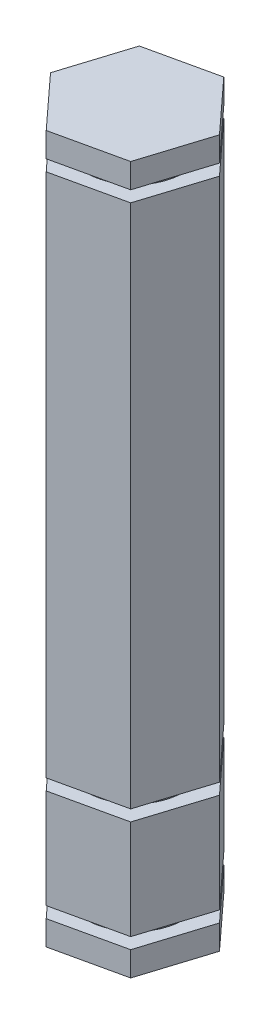
ISO-10303-21;
HEADER;
FILE_DESCRIPTION(('STEP AP214'),'2;1');
FILE_NAME('part.step','',(''),(''),'','','');
FILE_SCHEMA(('AUTOMOTIVE_DESIGN { 1 0 10303 214 1 1 1 1 }'));
ENDSEC;
DATA;
#1=APPLICATION_CONTEXT('core data for automotive mechanical design processes');
#2=APPLICATION_PROTOCOL_DEFINITION('international standard','automotive_design',2000,#1);
#3=PRODUCT_CONTEXT('',#1,'mechanical');
#4=PRODUCT('Part','Part','',(#3));
#5=PRODUCT_RELATED_PRODUCT_CATEGORY('part','',(#4));
#6=PRODUCT_DEFINITION_FORMATION('','',#4);
#7=PRODUCT_DEFINITION_CONTEXT('part definition',#1,'design');
#8=PRODUCT_DEFINITION('design','',#6,#7);
#9=PRODUCT_DEFINITION_SHAPE('','',#8);
#10=(LENGTH_UNIT() NAMED_UNIT(*) SI_UNIT(.MILLI.,.METRE.));
#11=(NAMED_UNIT(*) PLANE_ANGLE_UNIT() SI_UNIT($,.RADIAN.));
#12=(NAMED_UNIT(*) SI_UNIT($,.STERADIAN.) SOLID_ANGLE_UNIT());
#13=UNCERTAINTY_MEASURE_WITH_UNIT(LENGTH_MEASURE(1.E-05),#10,'distance_accuracy_value','');
#14=(GEOMETRIC_REPRESENTATION_CONTEXT(3) GLOBAL_UNCERTAINTY_ASSIGNED_CONTEXT((#13)) GLOBAL_UNIT_ASSIGNED_CONTEXT((#10,
#11,#12)) REPRESENTATION_CONTEXT('',''));
#15=CARTESIAN_POINT('',(0.,0.,0.));
#16=DIRECTION('',(0.,0.,1.));
#17=DIRECTION('',(1.,0.,0.));
#18=AXIS2_PLACEMENT_3D('',#15,#16,#17);
#19=CARTESIAN_POINT('',(0.,-11.4554,0.));
#20=DIRECTION('',(0.,-1.,0.));
#21=DIRECTION('',(0.,0.,-1.));
#22=AXIS2_PLACEMENT_3D('',#19,#20,#21);
#23=PLANE('',#22);
#24=DIRECTION('',(-0.30003437049555,0.,0.95392839171572));
#25=VECTOR('',#24,1.);
#26=CARTESIAN_POINT('',(7.1574235584254,-11.4554,-1.59204941463209));
#27=LINE('',#26,#25);
#28=CARTESIAN_POINT('',(7.1574235584254,-11.4554,-1.59204941463209));
#29=VERTEX_POINT('',#28);
#30=CARTESIAN_POINT('',(4.95746701636423,-11.4554,5.40248591992557));
#31=VERTEX_POINT('',#30);
#32=EDGE_CURVE('E240',#29,#31,#27,.T.);
#33=ORIENTED_EDGE('',*,*,#32,.T.);
#34=DIRECTION('',(-0.976143405864821,0.,0.217126809000241));
#35=VECTOR('',#34,1.);
#36=CARTESIAN_POINT('',(4.95746701636423,-11.4554,5.40248591992557));
#37=LINE('',#36,#35);
#38=CARTESIAN_POINT('',(-2.19995654206117,-11.4554,6.99453533455765));
#39=VERTEX_POINT('',#38);
#40=EDGE_CURVE('E268',#31,#39,#37,.T.);
#41=ORIENTED_EDGE('',*,*,#40,.T.);
#42=DIRECTION('',(-0.676109035369271,0.,-0.736801582715478));
#43=VECTOR('',#42,1.);
#44=CARTESIAN_POINT('',(-2.19995654206117,-11.4554,6.99453533455765));
#45=LINE('',#44,#43);
#46=CARTESIAN_POINT('',(-7.1574235584254,-11.4554,1.59204941463208));
#47=VERTEX_POINT('',#46);
#48=EDGE_CURVE('E265',#39,#47,#45,.T.);
#49=ORIENTED_EDGE('',*,*,#48,.T.);
#50=DIRECTION('',(0.30003437049555,0.,-0.953928391715719));
#51=VECTOR('',#50,1.);
#52=CARTESIAN_POINT('',(-7.1574235584254,-11.4554,1.59204941463208));
#53=LINE('',#52,#51);
#54=CARTESIAN_POINT('',(-4.95746701636423,-11.4554,-5.40248591992557));
#55=VERTEX_POINT('',#54);
#56=EDGE_CURVE('E262',#47,#55,#53,.T.);
#57=ORIENTED_EDGE('',*,*,#56,.T.);
#58=DIRECTION('',(0.976143405864821,0.,-0.217126809000241));
#59=VECTOR('',#58,1.);
#60=CARTESIAN_POINT('',(-4.95746701636423,-11.4554,-5.40248591992557));
#61=LINE('',#60,#59);
#62=CARTESIAN_POINT('',(2.19995654206117,-11.4554,-6.99453533455766));
#63=VERTEX_POINT('',#62);
#64=EDGE_CURVE('E259',#55,#63,#61,.T.);
#65=ORIENTED_EDGE('',*,*,#64,.T.);
#66=DIRECTION('',(0.676109035369271,0.,0.736801582715478));
#67=VECTOR('',#66,1.);
#68=CARTESIAN_POINT('',(2.19995654206117,-11.4554,-6.99453533455766));
#69=LINE('',#68,#67);
#70=EDGE_CURVE('E236',#63,#29,#69,.T.);
#71=ORIENTED_EDGE('',*,*,#70,.T.);
#72=EDGE_LOOP('',(#33,#41,#49,#57,#65,#71));
#73=FACE_BOUND('',#72,.T.);
#74=CARTESIAN_POINT('',(0.,-11.4554,0.));
#75=DIRECTION('',(0.,-1.,0.));
#76=DIRECTION('',(0.,0.,-1.));
#77=AXIS2_PLACEMENT_3D('',#74,#75,#76);
#78=CIRCLE('',#77,5.0292);
#79=CARTESIAN_POINT('',(0.,-11.4554,-5.0292));
#80=VERTEX_POINT('',#79);
#81=EDGE_CURVE('E273',#80,#80,#78,.T.);
#82=ORIENTED_EDGE('',*,*,#81,.F.);
#83=EDGE_LOOP('',(#82));
#84=FACE_BOUND('',#83,.T.);
#85=ADVANCED_FACE('F34',(#73,#84),#23,.T.);
#86=CARTESIAN_POINT('',(0.,0.,0.));
#87=DIRECTION('',(0.,1.,0.));
#88=DIRECTION('',(0.,0.,1.));
#89=AXIS2_PLACEMENT_3D('',#86,#87,#88);
#90=PLANE('',#89);
#91=DIRECTION('',(0.976143405864821,0.,-0.217126809000241));
#92=VECTOR('',#91,1.);
#93=CARTESIAN_POINT('',(-2.19995654206117,0.,6.99453533455765));
#94=LINE('',#93,#92);
#95=CARTESIAN_POINT('',(-2.19995654206117,0.,6.99453533455765));
#96=VERTEX_POINT('',#95);
#97=CARTESIAN_POINT('',(4.95746701636423,0.,5.40248591992557));
#98=VERTEX_POINT('',#97);
#99=EDGE_CURVE('E125',#96,#98,#94,.T.);
#100=ORIENTED_EDGE('',*,*,#99,.F.);
#101=DIRECTION('',(0.676109035369271,0.,0.736801582715478));
#102=VECTOR('',#101,1.);
#103=CARTESIAN_POINT('',(-7.1574235584254,0.,1.59204941463208));
#104=LINE('',#103,#102);
#105=CARTESIAN_POINT('',(-7.1574235584254,0.,1.59204941463208));
#106=VERTEX_POINT('',#105);
#107=EDGE_CURVE('E81',#106,#96,#104,.T.);
#108=ORIENTED_EDGE('',*,*,#107,.F.);
#109=DIRECTION('',(-0.30003437049555,0.,0.953928391715719));
#110=VECTOR('',#109,1.);
#111=CARTESIAN_POINT('',(-4.95746701636423,0.,-5.40248591992557));
#112=LINE('',#111,#110);
#113=CARTESIAN_POINT('',(-4.95746701636423,0.,-5.40248591992557));
#114=VERTEX_POINT('',#113);
#115=EDGE_CURVE('E75',#114,#106,#112,.T.);
#116=ORIENTED_EDGE('',*,*,#115,.F.);
#117=DIRECTION('',(-0.976143405864821,0.,0.217126809000241));
#118=VECTOR('',#117,1.);
#119=CARTESIAN_POINT('',(2.19995654206117,0.,-6.99453533455766));
#120=LINE('',#119,#118);
#121=CARTESIAN_POINT('',(2.19995654206117,0.,-6.99453533455766));
#122=VERTEX_POINT('',#121);
#123=EDGE_CURVE('E115',#122,#114,#120,.T.);
#124=ORIENTED_EDGE('',*,*,#123,.F.);
#125=DIRECTION('',(-0.676109035369271,0.,-0.736801582715478));
#126=VECTOR('',#125,1.);
#127=CARTESIAN_POINT('',(7.1574235584254,0.,-1.59204941463209));
#128=LINE('',#127,#126);
#129=CARTESIAN_POINT('',(7.1574235584254,0.,-1.59204941463209));
#130=VERTEX_POINT('',#129);
#131=EDGE_CURVE('E131',#130,#122,#128,.T.);
#132=ORIENTED_EDGE('',*,*,#131,.F.);
#133=DIRECTION('',(0.30003437049555,0.,-0.95392839171572));
#134=VECTOR('',#133,1.);
#135=CARTESIAN_POINT('',(4.95746701636423,0.,5.40248591992557));
#136=LINE('',#135,#134);
#137=EDGE_CURVE('E128',#98,#130,#136,.T.);
#138=ORIENTED_EDGE('',*,*,#137,.F.);
#139=EDGE_LOOP('',(#100,#108,#116,#124,#132,#138));
#140=FACE_BOUND('',#139,.T.);
#141=CARTESIAN_POINT('',(0.,0.,0.));
#142=DIRECTION('',(0.,1.,0.));
#143=DIRECTION('',(0.,0.,1.));
#144=AXIS2_PLACEMENT_3D('',#141,#142,#143);
#145=CIRCLE('',#144,5.0292);
#146=CARTESIAN_POINT('',(0.,0.,5.0292));
#147=VERTEX_POINT('',#146);
#148=EDGE_CURVE('E11',#147,#147,#145,.F.);
#149=ORIENTED_EDGE('',*,*,#148,.F.);
#150=EDGE_LOOP('',(#149));
#151=FACE_BOUND('',#150,.T.);
#152=ADVANCED_FACE('F148',(#140,#151),#90,.F.);
#153=CARTESIAN_POINT('',(0.,54.356,0.));
#154=DIRECTION('',(0.,1.,0.));
#155=DIRECTION('',(0.,0.,1.));
#156=AXIS2_PLACEMENT_3D('',#153,#154,#155);
#157=PLANE('',#156);
#158=DIRECTION('',(0.976143405864821,0.,-0.217126809000241));
#159=VECTOR('',#158,1.);
#160=CARTESIAN_POINT('',(-2.19995654206117,54.356,6.99453533455765));
#161=LINE('',#160,#159);
#162=CARTESIAN_POINT('',(-2.19995654206117,54.356,6.99453533455765));
#163=VERTEX_POINT('',#162);
#164=CARTESIAN_POINT('',(4.95746701636423,54.356,5.40248591992557));
#165=VERTEX_POINT('',#164);
#166=EDGE_CURVE('E136',#163,#165,#161,.T.);
#167=ORIENTED_EDGE('',*,*,#166,.T.);
#168=DIRECTION('',(0.30003437049555,0.,-0.95392839171572));
#169=VECTOR('',#168,1.);
#170=CARTESIAN_POINT('',(4.95746701636423,54.356,5.40248591992557));
#171=LINE('',#170,#169);
#172=CARTESIAN_POINT('',(7.1574235584254,54.356,-1.59204941463209));
#173=VERTEX_POINT('',#172);
#174=EDGE_CURVE('E90',#165,#173,#171,.T.);
#175=ORIENTED_EDGE('',*,*,#174,.T.);
#176=DIRECTION('',(-0.676109035369271,0.,-0.736801582715478));
#177=VECTOR('',#176,1.);
#178=CARTESIAN_POINT('',(7.1574235584254,54.356,-1.59204941463209));
#179=LINE('',#178,#177);
#180=CARTESIAN_POINT('',(2.19995654206117,54.356,-6.99453533455766));
#181=VERTEX_POINT('',#180);
#182=EDGE_CURVE('E107',#173,#181,#179,.T.);
#183=ORIENTED_EDGE('',*,*,#182,.T.);
#184=DIRECTION('',(-0.976143405864821,0.,0.217126809000241));
#185=VECTOR('',#184,1.);
#186=CARTESIAN_POINT('',(2.19995654206117,54.356,-6.99453533455766));
#187=LINE('',#186,#185);
#188=CARTESIAN_POINT('',(-4.95746701636423,54.356,-5.40248591992557));
#189=VERTEX_POINT('',#188);
#190=EDGE_CURVE('E100',#181,#189,#187,.T.);
#191=ORIENTED_EDGE('',*,*,#190,.T.);
#192=DIRECTION('',(-0.30003437049555,0.,0.953928391715719));
#193=VECTOR('',#192,1.);
#194=CARTESIAN_POINT('',(-4.95746701636423,54.356,-5.40248591992557));
#195=LINE('',#194,#193);
#196=CARTESIAN_POINT('',(-7.1574235584254,54.356,1.59204941463208));
#197=VERTEX_POINT('',#196);
#198=EDGE_CURVE('E105',#189,#197,#195,.T.);
#199=ORIENTED_EDGE('',*,*,#198,.T.);
#200=DIRECTION('',(0.676109035369271,0.,0.736801582715478));
#201=VECTOR('',#200,1.);
#202=CARTESIAN_POINT('',(-7.1574235584254,54.356,1.59204941463208));
#203=LINE('',#202,#201);
#204=EDGE_CURVE('E51',#197,#163,#203,.T.);
#205=ORIENTED_EDGE('',*,*,#204,.T.);
#206=EDGE_LOOP('',(#167,#175,#183,#191,#199,#205));
#207=FACE_BOUND('',#206,.T.);
#208=CARTESIAN_POINT('',(0.,54.356,0.));
#209=DIRECTION('',(0.,1.,0.));
#210=DIRECTION('',(0.,0.,1.));
#211=AXIS2_PLACEMENT_3D('',#208,#209,#210);
#212=CIRCLE('',#211,5.0292);
#213=CARTESIAN_POINT('',(0.,54.356,5.0292));
#214=VERTEX_POINT('',#213);
#215=EDGE_CURVE('E156',#214,#214,#212,.T.);
#216=ORIENTED_EDGE('',*,*,#215,.F.);
#217=EDGE_LOOP('',(#216));
#218=FACE_BOUND('',#217,.T.);
#219=ADVANCED_FACE('F102',(#207,#218),#157,.T.);
#220=CARTESIAN_POINT('',(-2.19995654206117,54.356,6.99453533455765));
#221=DIRECTION('',(-0.217126809000241,0.,-0.976143405864821));
#222=DIRECTION('',(-0.976143405864821,0.,0.217126809000241));
#223=AXIS2_PLACEMENT_3D('',#220,#221,#222);
#224=PLANE('',#223);
#225=ORIENTED_EDGE('',*,*,#99,.T.);
#226=DIRECTION('',(0.,-1.,0.));
#227=VECTOR('',#226,1.);
#228=CARTESIAN_POINT('',(4.95746701636423,54.356,5.40248591992557));
#229=LINE('',#228,#227);
#230=EDGE_CURVE('E43',#165,#98,#229,.T.);
#231=ORIENTED_EDGE('',*,*,#230,.F.);
#232=ORIENTED_EDGE('',*,*,#166,.F.);
#233=DIRECTION('',(0.,-1.,0.));
#234=VECTOR('',#233,1.);
#235=CARTESIAN_POINT('',(-2.19995654206117,54.356,6.99453533455765));
#236=LINE('',#235,#234);
#237=EDGE_CURVE('E121',#163,#96,#236,.T.);
#238=ORIENTED_EDGE('',*,*,#237,.T.);
#239=EDGE_LOOP('',(#225,#231,#232,#238));
#240=FACE_BOUND('',#239,.T.);
#241=ADVANCED_FACE('F36',(#240),#224,.F.);
#242=CARTESIAN_POINT('',(4.95746701636423,54.356,5.40248591992557));
#243=DIRECTION('',(-0.953928391715719,0.,-0.30003437049555));
#244=DIRECTION('',(-0.30003437049555,0.,0.95392839171572));
#245=AXIS2_PLACEMENT_3D('',#242,#243,#244);
#246=PLANE('',#245);
#247=ORIENTED_EDGE('',*,*,#137,.T.);
#248=DIRECTION('',(0.,-1.,0.));
#249=VECTOR('',#248,1.);
#250=CARTESIAN_POINT('',(7.1574235584254,54.356,-1.59204941463209));
#251=LINE('',#250,#249);
#252=EDGE_CURVE('E140',#173,#130,#251,.T.);
#253=ORIENTED_EDGE('',*,*,#252,.F.);
#254=ORIENTED_EDGE('',*,*,#174,.F.);
#255=ORIENTED_EDGE('',*,*,#230,.T.);
#256=EDGE_LOOP('',(#247,#253,#254,#255));
#257=FACE_BOUND('',#256,.T.);
#258=ADVANCED_FACE('F143',(#257),#246,.F.);
#259=CARTESIAN_POINT('',(7.1574235584254,54.356,-1.59204941463209));
#260=DIRECTION('',(-0.736801582715478,0.,0.676109035369271));
#261=DIRECTION('',(0.676109035369271,0.,0.736801582715478));
#262=AXIS2_PLACEMENT_3D('',#259,#260,#261);
#263=PLANE('',#262);
#264=ORIENTED_EDGE('',*,*,#131,.T.);
#265=DIRECTION('',(0.,-1.,0.));
#266=VECTOR('',#265,1.);
#267=CARTESIAN_POINT('',(2.19995654206117,54.356,-6.99453533455766));
#268=LINE('',#267,#266);
#269=EDGE_CURVE('E116',#181,#122,#268,.T.);
#270=ORIENTED_EDGE('',*,*,#269,.F.);
#271=ORIENTED_EDGE('',*,*,#182,.F.);
#272=ORIENTED_EDGE('',*,*,#252,.T.);
#273=EDGE_LOOP('',(#264,#270,#271,#272));
#274=FACE_BOUND('',#273,.T.);
#275=ADVANCED_FACE('F152',(#274),#263,.F.);
#276=CARTESIAN_POINT('',(2.19995654206117,54.356,-6.99453533455766));
#277=DIRECTION('',(0.217126809000241,0.,0.976143405864821));
#278=DIRECTION('',(0.976143405864821,0.,-0.217126809000241));
#279=AXIS2_PLACEMENT_3D('',#276,#277,#278);
#280=PLANE('',#279);
#281=ORIENTED_EDGE('',*,*,#123,.T.);
#282=DIRECTION('',(0.,-1.,0.));
#283=VECTOR('',#282,1.);
#284=CARTESIAN_POINT('',(-4.95746701636423,54.356,-5.40248591992557));
#285=LINE('',#284,#283);
#286=EDGE_CURVE('E112',#189,#114,#285,.T.);
#287=ORIENTED_EDGE('',*,*,#286,.F.);
#288=ORIENTED_EDGE('',*,*,#190,.F.);
#289=ORIENTED_EDGE('',*,*,#269,.T.);
#290=EDGE_LOOP('',(#281,#287,#288,#289));
#291=FACE_BOUND('',#290,.T.);
#292=ADVANCED_FACE('F113',(#291),#280,.F.);
#293=CARTESIAN_POINT('',(-4.95746701636423,54.356,-5.40248591992557));
#294=DIRECTION('',(0.953928391715719,0.,0.30003437049555));
#295=DIRECTION('',(0.30003437049555,0.,-0.95392839171572));
#296=AXIS2_PLACEMENT_3D('',#293,#294,#295);
#297=PLANE('',#296);
#298=ORIENTED_EDGE('',*,*,#115,.T.);
#299=DIRECTION('',(0.,-1.,0.));
#300=VECTOR('',#299,1.);
#301=CARTESIAN_POINT('',(-7.1574235584254,54.356,1.59204941463208));
#302=LINE('',#301,#300);
#303=EDGE_CURVE('E117',#197,#106,#302,.T.);
#304=ORIENTED_EDGE('',*,*,#303,.F.);
#305=ORIENTED_EDGE('',*,*,#198,.F.);
#306=ORIENTED_EDGE('',*,*,#286,.T.);
#307=EDGE_LOOP('',(#298,#304,#305,#306));
#308=FACE_BOUND('',#307,.T.);
#309=ADVANCED_FACE('F119',(#308),#297,.F.);
#310=CARTESIAN_POINT('',(-7.1574235584254,54.356,1.59204941463208));
#311=DIRECTION('',(0.736801582715478,0.,-0.676109035369271));
#312=DIRECTION('',(-0.676109035369271,0.,-0.736801582715478));
#313=AXIS2_PLACEMENT_3D('',#310,#311,#312);
#314=PLANE('',#313);
#315=ORIENTED_EDGE('',*,*,#107,.T.);
#316=ORIENTED_EDGE('',*,*,#237,.F.);
#317=ORIENTED_EDGE('',*,*,#204,.F.);
#318=ORIENTED_EDGE('',*,*,#303,.T.);
#319=EDGE_LOOP('',(#315,#316,#317,#318));
#320=FACE_BOUND('',#319,.T.);
#321=ADVANCED_FACE('F505',(#320),#314,.F.);
#322=CARTESIAN_POINT('',(0.,55.5244,0.));
#323=DIRECTION('',(0.,-1.,0.));
#324=DIRECTION('',(0.,0.,-1.));
#325=AXIS2_PLACEMENT_3D('',#322,#323,#324);
#326=CYLINDRICAL_SURFACE('',#325,5.0292);
#327=CARTESIAN_POINT('',(0.,55.5244,0.));
#328=DIRECTION('',(0.,1.,0.));
#329=DIRECTION('',(0.,0.,1.));
#330=AXIS2_PLACEMENT_3D('',#327,#328,#329);
#331=CIRCLE('',#330,5.0292);
#332=CARTESIAN_POINT('',(0.,55.5244,5.0292));
#333=VERTEX_POINT('',#332);
#334=EDGE_CURVE('E129',#333,#333,#331,.T.);
#335=ORIENTED_EDGE('',*,*,#334,.F.);
#336=EDGE_LOOP('',(#335));
#337=FACE_BOUND('',#336,.T.);
#338=ORIENTED_EDGE('',*,*,#215,.T.);
#339=EDGE_LOOP('',(#338));
#340=FACE_BOUND('',#339,.T.);
#341=ADVANCED_FACE('F499',(#337,#340),#326,.T.);
#342=CARTESIAN_POINT('',(0.,55.5244,0.));
#343=DIRECTION('',(0.,1.,0.));
#344=DIRECTION('',(0.,0.,1.));
#345=AXIS2_PLACEMENT_3D('',#342,#343,#344);
#346=PLANE('',#345);
#347=DIRECTION('',(0.676109035369271,0.,0.736801582715478));
#348=VECTOR('',#347,1.);
#349=CARTESIAN_POINT('',(-7.1574235584254,55.5244,1.59204941463208));
#350=LINE('',#349,#348);
#351=CARTESIAN_POINT('',(-7.1574235584254,55.5244,1.59204941463208));
#352=VERTEX_POINT('',#351);
#353=CARTESIAN_POINT('',(-2.19995654206117,55.5244,6.99453533455765));
#354=VERTEX_POINT('',#353);
#355=EDGE_CURVE('E196',#352,#354,#350,.T.);
#356=ORIENTED_EDGE('',*,*,#355,.F.);
#357=DIRECTION('',(-0.30003437049555,0.,0.953928391715719));
#358=VECTOR('',#357,1.);
#359=CARTESIAN_POINT('',(-4.95746701636423,55.5244,-5.40248591992557));
#360=LINE('',#359,#358);
#361=CARTESIAN_POINT('',(-4.95746701636423,55.5244,-5.40248591992557));
#362=VERTEX_POINT('',#361);
#363=EDGE_CURVE('E180',#362,#352,#360,.T.);
#364=ORIENTED_EDGE('',*,*,#363,.F.);
#365=DIRECTION('',(-0.976143405864821,0.,0.217126809000241));
#366=VECTOR('',#365,1.);
#367=CARTESIAN_POINT('',(2.19995654206117,55.5244,-6.99453533455766));
#368=LINE('',#367,#366);
#369=CARTESIAN_POINT('',(2.19995654206117,55.5244,-6.99453533455766));
#370=VERTEX_POINT('',#369);
#371=EDGE_CURVE('E184',#370,#362,#368,.T.);
#372=ORIENTED_EDGE('',*,*,#371,.F.);
#373=DIRECTION('',(-0.676109035369271,0.,-0.736801582715478));
#374=VECTOR('',#373,1.);
#375=CARTESIAN_POINT('',(7.1574235584254,55.5244,-1.59204941463209));
#376=LINE('',#375,#374);
#377=CARTESIAN_POINT('',(7.1574235584254,55.5244,-1.59204941463209));
#378=VERTEX_POINT('',#377);
#379=EDGE_CURVE('E187',#378,#370,#376,.T.);
#380=ORIENTED_EDGE('',*,*,#379,.F.);
#381=DIRECTION('',(0.30003437049555,0.,-0.95392839171572));
#382=VECTOR('',#381,1.);
#383=CARTESIAN_POINT('',(4.95746701636423,55.5244,5.40248591992557));
#384=LINE('',#383,#382);
#385=CARTESIAN_POINT('',(4.95746701636423,55.5244,5.40248591992557));
#386=VERTEX_POINT('',#385);
#387=EDGE_CURVE('E190',#386,#378,#384,.T.);
#388=ORIENTED_EDGE('',*,*,#387,.F.);
#389=DIRECTION('',(0.976143405864821,0.,-0.217126809000241));
#390=VECTOR('',#389,1.);
#391=CARTESIAN_POINT('',(-2.19995654206117,55.5244,6.99453533455765));
#392=LINE('',#391,#390);
#393=EDGE_CURVE('E193',#354,#386,#392,.T.);
#394=ORIENTED_EDGE('',*,*,#393,.F.);
#395=EDGE_LOOP('',(#356,#364,#372,#380,#388,#394));
#396=FACE_BOUND('',#395,.T.);
#397=ORIENTED_EDGE('',*,*,#334,.T.);
#398=EDGE_LOOP('',(#397));
#399=FACE_BOUND('',#398,.T.);
#400=ADVANCED_FACE('F427',(#396,#399),#346,.F.);
#401=CARTESIAN_POINT('',(-7.1574235584254,58.0644,1.59204941463208));
#402=DIRECTION('',(0.736801582715478,0.,-0.676109035369271));
#403=DIRECTION('',(-0.676109035369271,0.,-0.736801582715478));
#404=AXIS2_PLACEMENT_3D('',#401,#402,#403);
#405=PLANE('',#404);
#406=ORIENTED_EDGE('',*,*,#355,.T.);
#407=DIRECTION('',(0.,-1.,0.));
#408=VECTOR('',#407,1.);
#409=CARTESIAN_POINT('',(-2.19995654206117,58.0644,6.99453533455765));
#410=LINE('',#409,#408);
#411=CARTESIAN_POINT('',(-2.19995654206117,58.0644,6.99453533455765));
#412=VERTEX_POINT('',#411);
#413=EDGE_CURVE('E159',#412,#354,#410,.T.);
#414=ORIENTED_EDGE('',*,*,#413,.F.);
#415=DIRECTION('',(0.676109035369271,0.,0.736801582715478));
#416=VECTOR('',#415,1.);
#417=CARTESIAN_POINT('',(-7.1574235584254,58.0644,1.59204941463208));
#418=LINE('',#417,#416);
#419=CARTESIAN_POINT('',(-7.1574235584254,58.0644,1.59204941463208));
#420=VERTEX_POINT('',#419);
#421=EDGE_CURVE('E183',#420,#412,#418,.T.);
#422=ORIENTED_EDGE('',*,*,#421,.F.);
#423=DIRECTION('',(0.,-1.,0.));
#424=VECTOR('',#423,1.);
#425=CARTESIAN_POINT('',(-7.1574235584254,58.0644,1.59204941463208));
#426=LINE('',#425,#424);
#427=EDGE_CURVE('E176',#420,#352,#426,.T.);
#428=ORIENTED_EDGE('',*,*,#427,.T.);
#429=EDGE_LOOP('',(#406,#414,#422,#428));
#430=FACE_BOUND('',#429,.T.);
#431=ADVANCED_FACE('F425',(#430),#405,.F.);
#432=CARTESIAN_POINT('',(-2.19995654206117,58.0644,6.99453533455765));
#433=DIRECTION('',(-0.217126809000241,0.,-0.976143405864821));
#434=DIRECTION('',(-0.976143405864821,0.,0.217126809000241));
#435=AXIS2_PLACEMENT_3D('',#432,#433,#434);
#436=PLANE('',#435);
#437=ORIENTED_EDGE('',*,*,#393,.T.);
#438=DIRECTION('',(0.,-1.,0.));
#439=VECTOR('',#438,1.);
#440=CARTESIAN_POINT('',(4.95746701636423,58.0644,5.40248591992557));
#441=LINE('',#440,#439);
#442=CARTESIAN_POINT('',(4.95746701636423,58.0644,5.40248591992557));
#443=VERTEX_POINT('',#442);
#444=EDGE_CURVE('E164',#443,#386,#441,.T.);
#445=ORIENTED_EDGE('',*,*,#444,.F.);
#446=DIRECTION('',(0.976143405864821,0.,-0.217126809000241));
#447=VECTOR('',#446,1.);
#448=CARTESIAN_POINT('',(-2.19995654206117,58.0644,6.99453533455765));
#449=LINE('',#448,#447);
#450=EDGE_CURVE('E211',#412,#443,#449,.T.);
#451=ORIENTED_EDGE('',*,*,#450,.F.);
#452=ORIENTED_EDGE('',*,*,#413,.T.);
#453=EDGE_LOOP('',(#437,#445,#451,#452));
#454=FACE_BOUND('',#453,.T.);
#455=ADVANCED_FACE('F433',(#454),#436,.F.);
#456=CARTESIAN_POINT('',(4.95746701636423,58.0644,5.40248591992557));
#457=DIRECTION('',(-0.95392839171572,0.,-0.30003437049555));
#458=DIRECTION('',(-0.30003437049555,0.,0.95392839171572));
#459=AXIS2_PLACEMENT_3D('',#456,#457,#458);
#460=PLANE('',#459);
#461=ORIENTED_EDGE('',*,*,#387,.T.);
#462=DIRECTION('',(0.,-1.,0.));
#463=VECTOR('',#462,1.);
#464=CARTESIAN_POINT('',(7.1574235584254,58.0644,-1.59204941463209));
#465=LINE('',#464,#463);
#466=CARTESIAN_POINT('',(7.1574235584254,58.0644,-1.59204941463209));
#467=VERTEX_POINT('',#466);
#468=EDGE_CURVE('E167',#467,#378,#465,.T.);
#469=ORIENTED_EDGE('',*,*,#468,.F.);
#470=DIRECTION('',(0.30003437049555,0.,-0.95392839171572));
#471=VECTOR('',#470,1.);
#472=CARTESIAN_POINT('',(4.95746701636423,58.0644,5.40248591992557));
#473=LINE('',#472,#471);
#474=EDGE_CURVE('E208',#443,#467,#473,.T.);
#475=ORIENTED_EDGE('',*,*,#474,.F.);
#476=ORIENTED_EDGE('',*,*,#444,.T.);
#477=EDGE_LOOP('',(#461,#469,#475,#476));
#478=FACE_BOUND('',#477,.T.);
#479=ADVANCED_FACE('F449',(#478),#460,.F.);
#480=CARTESIAN_POINT('',(7.1574235584254,58.0644,-1.59204941463209));
#481=DIRECTION('',(-0.736801582715478,0.,0.676109035369271));
#482=DIRECTION('',(0.676109035369271,0.,0.736801582715478));
#483=AXIS2_PLACEMENT_3D('',#480,#481,#482);
#484=PLANE('',#483);
#485=ORIENTED_EDGE('',*,*,#379,.T.);
#486=DIRECTION('',(0.,-1.,0.));
#487=VECTOR('',#486,1.);
#488=CARTESIAN_POINT('',(2.19995654206117,58.0644,-6.99453533455766));
#489=LINE('',#488,#487);
#490=CARTESIAN_POINT('',(2.19995654206117,58.0644,-6.99453533455766));
#491=VERTEX_POINT('',#490);
#492=EDGE_CURVE('E170',#491,#370,#489,.T.);
#493=ORIENTED_EDGE('',*,*,#492,.F.);
#494=DIRECTION('',(-0.676109035369271,0.,-0.736801582715478));
#495=VECTOR('',#494,1.);
#496=CARTESIAN_POINT('',(7.1574235584254,58.0644,-1.59204941463209));
#497=LINE('',#496,#495);
#498=EDGE_CURVE('E205',#467,#491,#497,.T.);
#499=ORIENTED_EDGE('',*,*,#498,.F.);
#500=ORIENTED_EDGE('',*,*,#468,.T.);
#501=EDGE_LOOP('',(#485,#493,#499,#500));
#502=FACE_BOUND('',#501,.T.);
#503=ADVANCED_FACE('F442',(#502),#484,.F.);
#504=CARTESIAN_POINT('',(2.19995654206117,58.0644,-6.99453533455766));
#505=DIRECTION('',(0.217126809000241,0.,0.976143405864821));
#506=DIRECTION('',(0.976143405864821,0.,-0.217126809000241));
#507=AXIS2_PLACEMENT_3D('',#504,#505,#506);
#508=PLANE('',#507);
#509=ORIENTED_EDGE('',*,*,#371,.T.);
#510=DIRECTION('',(0.,-1.,0.));
#511=VECTOR('',#510,1.);
#512=CARTESIAN_POINT('',(-4.95746701636423,58.0644,-5.40248591992557));
#513=LINE('',#512,#511);
#514=CARTESIAN_POINT('',(-4.95746701636423,58.0644,-5.40248591992557));
#515=VERTEX_POINT('',#514);
#516=EDGE_CURVE('E173',#515,#362,#513,.T.);
#517=ORIENTED_EDGE('',*,*,#516,.F.);
#518=DIRECTION('',(-0.976143405864821,0.,0.217126809000241));
#519=VECTOR('',#518,1.);
#520=CARTESIAN_POINT('',(2.19995654206117,58.0644,-6.99453533455766));
#521=LINE('',#520,#519);
#522=EDGE_CURVE('E202',#491,#515,#521,.T.);
#523=ORIENTED_EDGE('',*,*,#522,.F.);
#524=ORIENTED_EDGE('',*,*,#492,.T.);
#525=EDGE_LOOP('',(#509,#517,#523,#524));
#526=FACE_BOUND('',#525,.T.);
#527=ADVANCED_FACE('F440',(#526),#508,.F.);
#528=CARTESIAN_POINT('',(-4.95746701636423,58.0644,-5.40248591992557));
#529=DIRECTION('',(0.953928391715719,0.,0.30003437049555));
#530=DIRECTION('',(0.30003437049555,0.,-0.95392839171572));
#531=AXIS2_PLACEMENT_3D('',#528,#529,#530);
#532=PLANE('',#531);
#533=ORIENTED_EDGE('',*,*,#363,.T.);
#534=ORIENTED_EDGE('',*,*,#427,.F.);
#535=DIRECTION('',(-0.30003437049555,0.,0.953928391715719));
#536=VECTOR('',#535,1.);
#537=CARTESIAN_POINT('',(-4.95746701636423,58.0644,-5.40248591992557));
#538=LINE('',#537,#536);
#539=EDGE_CURVE('E179',#515,#420,#538,.T.);
#540=ORIENTED_EDGE('',*,*,#539,.F.);
#541=ORIENTED_EDGE('',*,*,#516,.T.);
#542=EDGE_LOOP('',(#533,#534,#540,#541));
#543=FACE_BOUND('',#542,.T.);
#544=ADVANCED_FACE('F419',(#543),#532,.F.);
#545=CARTESIAN_POINT('',(0.,58.0644,0.));
#546=DIRECTION('',(0.,1.,0.));
#547=DIRECTION('',(0.,0.,1.));
#548=AXIS2_PLACEMENT_3D('',#545,#546,#547);
#549=PLANE('',#548);
#550=ORIENTED_EDGE('',*,*,#421,.T.);
#551=ORIENTED_EDGE('',*,*,#450,.T.);
#552=ORIENTED_EDGE('',*,*,#474,.T.);
#553=ORIENTED_EDGE('',*,*,#498,.T.);
#554=ORIENTED_EDGE('',*,*,#522,.T.);
#555=ORIENTED_EDGE('',*,*,#539,.T.);
#556=EDGE_LOOP('',(#550,#551,#552,#553,#554,#555));
#557=FACE_BOUND('',#556,.T.);
#558=ADVANCED_FACE('F436',(#557),#549,.T.);
#559=CARTESIAN_POINT('',(0.,-1.1684,0.));
#560=DIRECTION('',(0.,1.,0.));
#561=DIRECTION('',(0.,0.,1.));
#562=AXIS2_PLACEMENT_3D('',#559,#560,#561);
#563=CYLINDRICAL_SURFACE('',#562,5.0292);
#564=CARTESIAN_POINT('',(0.,-1.1684,0.));
#565=DIRECTION('',(0.,-1.,0.));
#566=DIRECTION('',(0.,0.,-1.));
#567=AXIS2_PLACEMENT_3D('',#564,#565,#566);
#568=CIRCLE('',#567,5.0292);
#569=CARTESIAN_POINT('',(0.,-1.1684,-5.0292));
#570=VERTEX_POINT('',#569);
#571=EDGE_CURVE('E199',#570,#570,#568,.T.);
#572=ORIENTED_EDGE('',*,*,#571,.F.);
#573=EDGE_LOOP('',(#572));
#574=FACE_BOUND('',#573,.T.);
#575=ORIENTED_EDGE('',*,*,#148,.T.);
#576=EDGE_LOOP('',(#575));
#577=FACE_BOUND('',#576,.T.);
#578=ADVANCED_FACE('F468',(#574,#577),#563,.T.);
#579=CARTESIAN_POINT('',(0.,-1.1684,0.));
#580=DIRECTION('',(0.,-1.,0.));
#581=DIRECTION('',(0.,0.,-1.));
#582=AXIS2_PLACEMENT_3D('',#579,#580,#581);
#583=PLANE('',#582);
#584=DIRECTION('',(-0.30003437049555,0.,0.95392839171572));
#585=VECTOR('',#584,1.);
#586=CARTESIAN_POINT('',(7.1574235584254,-1.1684,-1.59204941463209));
#587=LINE('',#586,#585);
#588=CARTESIAN_POINT('',(7.1574235584254,-1.1684,-1.59204941463209));
#589=VERTEX_POINT('',#588);
#590=CARTESIAN_POINT('',(4.95746701636423,-1.1684,5.40248591992557));
#591=VERTEX_POINT('',#590);
#592=EDGE_CURVE('E253',#589,#591,#587,.T.);
#593=ORIENTED_EDGE('',*,*,#592,.F.);
#594=DIRECTION('',(0.676109035369271,0.,0.736801582715478));
#595=VECTOR('',#594,1.);
#596=CARTESIAN_POINT('',(2.19995654206117,-1.1684,-6.99453533455766));
#597=LINE('',#596,#595);
#598=CARTESIAN_POINT('',(2.19995654206117,-1.1684,-6.99453533455766));
#599=VERTEX_POINT('',#598);
#600=EDGE_CURVE('E237',#599,#589,#597,.T.);
#601=ORIENTED_EDGE('',*,*,#600,.F.);
#602=DIRECTION('',(0.976143405864821,0.,-0.217126809000241));
#603=VECTOR('',#602,1.);
#604=CARTESIAN_POINT('',(-4.95746701636423,-1.1684,-5.40248591992557));
#605=LINE('',#604,#603);
#606=CARTESIAN_POINT('',(-4.95746701636423,-1.1684,-5.40248591992557));
#607=VERTEX_POINT('',#606);
#608=EDGE_CURVE('E241',#607,#599,#605,.T.);
#609=ORIENTED_EDGE('',*,*,#608,.F.);
#610=DIRECTION('',(0.30003437049555,0.,-0.953928391715719));
#611=VECTOR('',#610,1.);
#612=CARTESIAN_POINT('',(-7.1574235584254,-1.1684,1.59204941463208));
#613=LINE('',#612,#611);
#614=CARTESIAN_POINT('',(-7.1574235584254,-1.1684,1.59204941463208));
#615=VERTEX_POINT('',#614);
#616=EDGE_CURVE('E244',#615,#607,#613,.T.);
#617=ORIENTED_EDGE('',*,*,#616,.F.);
#618=DIRECTION('',(-0.676109035369271,0.,-0.736801582715478));
#619=VECTOR('',#618,1.);
#620=CARTESIAN_POINT('',(-2.19995654206117,-1.1684,6.99453533455765));
#621=LINE('',#620,#619);
#622=CARTESIAN_POINT('',(-2.19995654206117,-1.1684,6.99453533455765));
#623=VERTEX_POINT('',#622);
#624=EDGE_CURVE('E247',#623,#615,#621,.T.);
#625=ORIENTED_EDGE('',*,*,#624,.F.);
#626=DIRECTION('',(-0.976143405864821,0.,0.217126809000241));
#627=VECTOR('',#626,1.);
#628=CARTESIAN_POINT('',(4.95746701636423,-1.1684,5.40248591992557));
#629=LINE('',#628,#627);
#630=EDGE_CURVE('E250',#591,#623,#629,.T.);
#631=ORIENTED_EDGE('',*,*,#630,.F.);
#632=EDGE_LOOP('',(#593,#601,#609,#617,#625,#631));
#633=FACE_BOUND('',#632,.T.);
#634=ORIENTED_EDGE('',*,*,#571,.T.);
#635=EDGE_LOOP('',(#634));
#636=FACE_BOUND('',#635,.T.);
#637=ADVANCED_FACE('F464',(#633,#636),#583,.F.);
#638=CARTESIAN_POINT('',(7.1574235584254,-11.4554,-1.59204941463209));
#639=DIRECTION('',(-0.95392839171572,0.,-0.30003437049555));
#640=DIRECTION('',(-0.30003437049555,0.,0.95392839171572));
#641=AXIS2_PLACEMENT_3D('',#638,#639,#640);
#642=PLANE('',#641);
#643=ORIENTED_EDGE('',*,*,#592,.T.);
#644=DIRECTION('',(0.,1.,0.));
#645=VECTOR('',#644,1.);
#646=CARTESIAN_POINT('',(4.95746701636423,-11.4554,5.40248591992557));
#647=LINE('',#646,#645);
#648=EDGE_CURVE('E218',#31,#591,#647,.T.);
#649=ORIENTED_EDGE('',*,*,#648,.F.);
#650=ORIENTED_EDGE('',*,*,#32,.F.);
#651=DIRECTION('',(0.,1.,0.));
#652=VECTOR('',#651,1.);
#653=CARTESIAN_POINT('',(7.1574235584254,-11.4554,-1.59204941463209));
#654=LINE('',#653,#652);
#655=EDGE_CURVE('E233',#29,#589,#654,.T.);
#656=ORIENTED_EDGE('',*,*,#655,.T.);
#657=EDGE_LOOP('',(#643,#649,#650,#656));
#658=FACE_BOUND('',#657,.T.);
#659=ADVANCED_FACE('F467',(#658),#642,.F.);
#660=CARTESIAN_POINT('',(4.95746701636423,-11.4554,5.40248591992557));
#661=DIRECTION('',(-0.217126809000241,0.,-0.976143405864821));
#662=DIRECTION('',(-0.976143405864821,0.,0.217126809000241));
#663=AXIS2_PLACEMENT_3D('',#660,#661,#662);
#664=PLANE('',#663);
#665=ORIENTED_EDGE('',*,*,#630,.T.);
#666=DIRECTION('',(0.,1.,0.));
#667=VECTOR('',#666,1.);
#668=CARTESIAN_POINT('',(-2.19995654206117,-11.4554,6.99453533455765));
#669=LINE('',#668,#667);
#670=EDGE_CURVE('E221',#39,#623,#669,.T.);
#671=ORIENTED_EDGE('',*,*,#670,.F.);
#672=ORIENTED_EDGE('',*,*,#40,.F.);
#673=ORIENTED_EDGE('',*,*,#648,.T.);
#674=EDGE_LOOP('',(#665,#671,#672,#673));
#675=FACE_BOUND('',#674,.T.);
#676=ADVANCED_FACE('F485',(#675),#664,.F.);
#677=CARTESIAN_POINT('',(-2.19995654206117,-11.4554,6.99453533455765));
#678=DIRECTION('',(0.736801582715478,0.,-0.676109035369271));
#679=DIRECTION('',(-0.676109035369271,0.,-0.736801582715478));
#680=AXIS2_PLACEMENT_3D('',#677,#678,#679);
#681=PLANE('',#680);
#682=ORIENTED_EDGE('',*,*,#624,.T.);
#683=DIRECTION('',(0.,1.,0.));
#684=VECTOR('',#683,1.);
#685=CARTESIAN_POINT('',(-7.1574235584254,-11.4554,1.59204941463208));
#686=LINE('',#685,#684);
#687=EDGE_CURVE('E224',#47,#615,#686,.T.);
#688=ORIENTED_EDGE('',*,*,#687,.F.);
#689=ORIENTED_EDGE('',*,*,#48,.F.);
#690=ORIENTED_EDGE('',*,*,#670,.T.);
#691=EDGE_LOOP('',(#682,#688,#689,#690));
#692=FACE_BOUND('',#691,.T.);
#693=ADVANCED_FACE('F481',(#692),#681,.F.);
#694=CARTESIAN_POINT('',(-7.1574235584254,-11.4554,1.59204941463208));
#695=DIRECTION('',(0.953928391715719,0.,0.30003437049555));
#696=DIRECTION('',(0.30003437049555,0.,-0.95392839171572));
#697=AXIS2_PLACEMENT_3D('',#694,#695,#696);
#698=PLANE('',#697);
#699=ORIENTED_EDGE('',*,*,#616,.T.);
#700=DIRECTION('',(0.,1.,0.));
#701=VECTOR('',#700,1.);
#702=CARTESIAN_POINT('',(-4.95746701636423,-11.4554,-5.40248591992557));
#703=LINE('',#702,#701);
#704=EDGE_CURVE('E227',#55,#607,#703,.T.);
#705=ORIENTED_EDGE('',*,*,#704,.F.);
#706=ORIENTED_EDGE('',*,*,#56,.F.);
#707=ORIENTED_EDGE('',*,*,#687,.T.);
#708=EDGE_LOOP('',(#699,#705,#706,#707));
#709=FACE_BOUND('',#708,.T.);
#710=ADVANCED_FACE('F477',(#709),#698,.F.);
#711=CARTESIAN_POINT('',(-4.95746701636423,-11.4554,-5.40248591992557));
#712=DIRECTION('',(0.217126809000241,0.,0.976143405864821));
#713=DIRECTION('',(0.976143405864821,0.,-0.217126809000241));
#714=AXIS2_PLACEMENT_3D('',#711,#712,#713);
#715=PLANE('',#714);
#716=ORIENTED_EDGE('',*,*,#608,.T.);
#717=DIRECTION('',(0.,1.,0.));
#718=VECTOR('',#717,1.);
#719=CARTESIAN_POINT('',(2.19995654206117,-11.4554,-6.99453533455766));
#720=LINE('',#719,#718);
#721=EDGE_CURVE('E230',#63,#599,#720,.T.);
#722=ORIENTED_EDGE('',*,*,#721,.F.);
#723=ORIENTED_EDGE('',*,*,#64,.F.);
#724=ORIENTED_EDGE('',*,*,#704,.T.);
#725=EDGE_LOOP('',(#716,#722,#723,#724));
#726=FACE_BOUND('',#725,.T.);
#727=ADVANCED_FACE('F473',(#726),#715,.F.);
#728=CARTESIAN_POINT('',(2.19995654206117,-11.4554,-6.99453533455766));
#729=DIRECTION('',(-0.736801582715478,0.,0.676109035369271));
#730=DIRECTION('',(0.676109035369271,0.,0.736801582715478));
#731=AXIS2_PLACEMENT_3D('',#728,#729,#730);
#732=PLANE('',#731);
#733=ORIENTED_EDGE('',*,*,#600,.T.);
#734=ORIENTED_EDGE('',*,*,#655,.F.);
#735=ORIENTED_EDGE('',*,*,#70,.F.);
#736=ORIENTED_EDGE('',*,*,#721,.T.);
#737=EDGE_LOOP('',(#733,#734,#735,#736));
#738=FACE_BOUND('',#737,.T.);
#739=ADVANCED_FACE('F470',(#738),#732,.F.);
#740=CARTESIAN_POINT('',(0.,-12.6238,0.));
#741=DIRECTION('',(0.,1.,0.));
#742=DIRECTION('',(0.,0.,1.));
#743=AXIS2_PLACEMENT_3D('',#740,#741,#742);
#744=CYLINDRICAL_SURFACE('',#743,5.0292);
#745=CARTESIAN_POINT('',(0.,-12.6238,0.));
#746=DIRECTION('',(0.,-1.,0.));
#747=DIRECTION('',(0.,0.,-1.));
#748=AXIS2_PLACEMENT_3D('',#745,#746,#747);
#749=CIRCLE('',#748,5.0292);
#750=CARTESIAN_POINT('',(0.,-12.6238,-5.0292));
#751=VERTEX_POINT('',#750);
#752=EDGE_CURVE('E256',#751,#751,#749,.T.);
#753=ORIENTED_EDGE('',*,*,#752,.F.);
#754=EDGE_LOOP('',(#753));
#755=FACE_BOUND('',#754,.T.);
#756=ORIENTED_EDGE('',*,*,#81,.T.);
#757=EDGE_LOOP('',(#756));
#758=FACE_BOUND('',#757,.T.);
#759=ADVANCED_FACE('F462',(#755,#758),#744,.T.);
#760=CARTESIAN_POINT('',(0.,-12.6238,0.));
#761=DIRECTION('',(0.,-1.,0.));
#762=DIRECTION('',(0.,0.,-1.));
#763=AXIS2_PLACEMENT_3D('',#760,#761,#762);
#764=PLANE('',#763);
#765=DIRECTION('',(0.676109035369271,0.,0.736801582715478));
#766=VECTOR('',#765,1.);
#767=CARTESIAN_POINT('',(2.19995654206117,-12.6238,-6.99453533455766));
#768=LINE('',#767,#766);
#769=CARTESIAN_POINT('',(2.19995654206117,-12.6238,-6.99453533455766));
#770=VERTEX_POINT('',#769);
#771=CARTESIAN_POINT('',(7.1574235584254,-12.6238,-1.59204941463209));
#772=VERTEX_POINT('',#771);
#773=EDGE_CURVE('E313',#770,#772,#768,.T.);
#774=ORIENTED_EDGE('',*,*,#773,.F.);
#775=DIRECTION('',(0.976143405864821,0.,-0.217126809000241));
#776=VECTOR('',#775,1.);
#777=CARTESIAN_POINT('',(-4.95746701636423,-12.6238,-5.40248591992557));
#778=LINE('',#777,#776);
#779=CARTESIAN_POINT('',(-4.95746701636423,-12.6238,-5.40248591992557));
#780=VERTEX_POINT('',#779);
#781=EDGE_CURVE('E297',#780,#770,#778,.T.);
#782=ORIENTED_EDGE('',*,*,#781,.F.);
#783=DIRECTION('',(0.30003437049555,0.,-0.953928391715719));
#784=VECTOR('',#783,1.);
#785=CARTESIAN_POINT('',(-7.1574235584254,-12.6238,1.59204941463208));
#786=LINE('',#785,#784);
#787=CARTESIAN_POINT('',(-7.1574235584254,-12.6238,1.59204941463208));
#788=VERTEX_POINT('',#787);
#789=EDGE_CURVE('E301',#788,#780,#786,.T.);
#790=ORIENTED_EDGE('',*,*,#789,.F.);
#791=DIRECTION('',(-0.676109035369271,0.,-0.736801582715478));
#792=VECTOR('',#791,1.);
#793=CARTESIAN_POINT('',(-2.19995654206117,-12.6238,6.99453533455765));
#794=LINE('',#793,#792);
#795=CARTESIAN_POINT('',(-2.19995654206117,-12.6238,6.99453533455765));
#796=VERTEX_POINT('',#795);
#797=EDGE_CURVE('E304',#796,#788,#794,.T.);
#798=ORIENTED_EDGE('',*,*,#797,.F.);
#799=DIRECTION('',(-0.976143405864821,0.,0.217126809000241));
#800=VECTOR('',#799,1.);
#801=CARTESIAN_POINT('',(4.95746701636423,-12.6238,5.40248591992557));
#802=LINE('',#801,#800);
#803=CARTESIAN_POINT('',(4.95746701636423,-12.6238,5.40248591992557));
#804=VERTEX_POINT('',#803);
#805=EDGE_CURVE('E307',#804,#796,#802,.T.);
#806=ORIENTED_EDGE('',*,*,#805,.F.);
#807=DIRECTION('',(-0.30003437049555,0.,0.95392839171572));
#808=VECTOR('',#807,1.);
#809=CARTESIAN_POINT('',(7.1574235584254,-12.6238,-1.59204941463209));
#810=LINE('',#809,#808);
#811=EDGE_CURVE('E310',#772,#804,#810,.T.);
#812=ORIENTED_EDGE('',*,*,#811,.F.);
#813=EDGE_LOOP('',(#774,#782,#790,#798,#806,#812));
#814=FACE_BOUND('',#813,.T.);
#815=ORIENTED_EDGE('',*,*,#752,.T.);
#816=EDGE_LOOP('',(#815));
#817=FACE_BOUND('',#816,.T.);
#818=ADVANCED_FACE('F603',(#814,#817),#764,.F.);
#819=CARTESIAN_POINT('',(2.19995654206117,-15.1638,-6.99453533455766));
#820=DIRECTION('',(-0.736801582715478,0.,0.676109035369271));
#821=DIRECTION('',(0.676109035369271,0.,0.736801582715478));
#822=AXIS2_PLACEMENT_3D('',#819,#820,#821);
#823=PLANE('',#822);
#824=ORIENTED_EDGE('',*,*,#773,.T.);
#825=DIRECTION('',(0.,1.,0.));
#826=VECTOR('',#825,1.);
#827=CARTESIAN_POINT('',(7.1574235584254,-15.1638,-1.59204941463209));
#828=LINE('',#827,#826);
#829=CARTESIAN_POINT('',(7.1574235584254,-15.1638,-1.59204941463209));
#830=VERTEX_POINT('',#829);
#831=EDGE_CURVE('E276',#830,#772,#828,.T.);
#832=ORIENTED_EDGE('',*,*,#831,.F.);
#833=DIRECTION('',(0.676109035369271,0.,0.736801582715478));
#834=VECTOR('',#833,1.);
#835=CARTESIAN_POINT('',(2.19995654206117,-15.1638,-6.99453533455766));
#836=LINE('',#835,#834);
#837=CARTESIAN_POINT('',(2.19995654206117,-15.1638,-6.99453533455766));
#838=VERTEX_POINT('',#837);
#839=EDGE_CURVE('E300',#838,#830,#836,.T.);
#840=ORIENTED_EDGE('',*,*,#839,.F.);
#841=DIRECTION('',(0.,1.,0.));
#842=VECTOR('',#841,1.);
#843=CARTESIAN_POINT('',(2.19995654206117,-15.1638,-6.99453533455766));
#844=LINE('',#843,#842);
#845=EDGE_CURVE('E293',#838,#770,#844,.T.);
#846=ORIENTED_EDGE('',*,*,#845,.T.);
#847=EDGE_LOOP('',(#824,#832,#840,#846));
#848=FACE_BOUND('',#847,.T.);
#849=ADVANCED_FACE('F345',(#848),#823,.F.);
#850=CARTESIAN_POINT('',(7.1574235584254,-15.1638,-1.59204941463209));
#851=DIRECTION('',(-0.95392839171572,0.,-0.30003437049555));
#852=DIRECTION('',(-0.30003437049555,0.,0.95392839171572));
#853=AXIS2_PLACEMENT_3D('',#850,#851,#852);
#854=PLANE('',#853);
#855=ORIENTED_EDGE('',*,*,#811,.T.);
#856=DIRECTION('',(0.,1.,0.));
#857=VECTOR('',#856,1.);
#858=CARTESIAN_POINT('',(4.95746701636423,-15.1638,5.40248591992557));
#859=LINE('',#858,#857);
#860=CARTESIAN_POINT('',(4.95746701636423,-15.1638,5.40248591992557));
#861=VERTEX_POINT('',#860);
#862=EDGE_CURVE('E281',#861,#804,#859,.T.);
#863=ORIENTED_EDGE('',*,*,#862,.F.);
#864=DIRECTION('',(-0.30003437049555,0.,0.95392839171572));
#865=VECTOR('',#864,1.);
#866=CARTESIAN_POINT('',(7.1574235584254,-15.1638,-1.59204941463209));
#867=LINE('',#866,#865);
#868=EDGE_CURVE('E327',#830,#861,#867,.T.);
#869=ORIENTED_EDGE('',*,*,#868,.F.);
#870=ORIENTED_EDGE('',*,*,#831,.T.);
#871=EDGE_LOOP('',(#855,#863,#869,#870));
#872=FACE_BOUND('',#871,.T.);
#873=ADVANCED_FACE('F349',(#872),#854,.F.);
#874=CARTESIAN_POINT('',(4.95746701636423,-15.1638,5.40248591992557));
#875=DIRECTION('',(-0.217126809000241,0.,-0.976143405864821));
#876=DIRECTION('',(-0.976143405864821,0.,0.217126809000241));
#877=AXIS2_PLACEMENT_3D('',#874,#875,#876);
#878=PLANE('',#877);
#879=ORIENTED_EDGE('',*,*,#805,.T.);
#880=DIRECTION('',(0.,1.,0.));
#881=VECTOR('',#880,1.);
#882=CARTESIAN_POINT('',(-2.19995654206117,-15.1638,6.99453533455765));
#883=LINE('',#882,#881);
#884=CARTESIAN_POINT('',(-2.19995654206117,-15.1638,6.99453533455765));
#885=VERTEX_POINT('',#884);
#886=EDGE_CURVE('E284',#885,#796,#883,.T.);
#887=ORIENTED_EDGE('',*,*,#886,.F.);
#888=DIRECTION('',(-0.976143405864821,0.,0.217126809000241));
#889=VECTOR('',#888,1.);
#890=CARTESIAN_POINT('',(4.95746701636423,-15.1638,5.40248591992557));
#891=LINE('',#890,#889);
#892=EDGE_CURVE('E324',#861,#885,#891,.T.);
#893=ORIENTED_EDGE('',*,*,#892,.F.);
#894=ORIENTED_EDGE('',*,*,#862,.T.);
#895=EDGE_LOOP('',(#879,#887,#893,#894));
#896=FACE_BOUND('',#895,.T.);
#897=ADVANCED_FACE('F627',(#896),#878,.F.);
#898=CARTESIAN_POINT('',(-2.19995654206117,-15.1638,6.99453533455765));
#899=DIRECTION('',(0.736801582715478,0.,-0.676109035369271));
#900=DIRECTION('',(-0.676109035369271,0.,-0.736801582715478));
#901=AXIS2_PLACEMENT_3D('',#898,#899,#900);
#902=PLANE('',#901);
#903=ORIENTED_EDGE('',*,*,#797,.T.);
#904=DIRECTION('',(0.,1.,0.));
#905=VECTOR('',#904,1.);
#906=CARTESIAN_POINT('',(-7.1574235584254,-15.1638,1.59204941463208));
#907=LINE('',#906,#905);
#908=CARTESIAN_POINT('',(-7.1574235584254,-15.1638,1.59204941463208));
#909=VERTEX_POINT('',#908);
#910=EDGE_CURVE('E287',#909,#788,#907,.T.);
#911=ORIENTED_EDGE('',*,*,#910,.F.);
#912=DIRECTION('',(-0.676109035369271,0.,-0.736801582715478));
#913=VECTOR('',#912,1.);
#914=CARTESIAN_POINT('',(-2.19995654206117,-15.1638,6.99453533455765));
#915=LINE('',#914,#913);
#916=EDGE_CURVE('E321',#885,#909,#915,.T.);
#917=ORIENTED_EDGE('',*,*,#916,.F.);
#918=ORIENTED_EDGE('',*,*,#886,.T.);
#919=EDGE_LOOP('',(#903,#911,#917,#918));
#920=FACE_BOUND('',#919,.T.);
#921=ADVANCED_FACE('F636',(#920),#902,.F.);
#922=CARTESIAN_POINT('',(-7.1574235584254,-15.1638,1.59204941463208));
#923=DIRECTION('',(0.953928391715719,0.,0.30003437049555));
#924=DIRECTION('',(0.30003437049555,0.,-0.95392839171572));
#925=AXIS2_PLACEMENT_3D('',#922,#923,#924);
#926=PLANE('',#925);
#927=ORIENTED_EDGE('',*,*,#789,.T.);
#928=DIRECTION('',(0.,1.,0.));
#929=VECTOR('',#928,1.);
#930=CARTESIAN_POINT('',(-4.95746701636423,-15.1638,-5.40248591992557));
#931=LINE('',#930,#929);
#932=CARTESIAN_POINT('',(-4.95746701636423,-15.1638,-5.40248591992557));
#933=VERTEX_POINT('',#932);
#934=EDGE_CURVE('E290',#933,#780,#931,.T.);
#935=ORIENTED_EDGE('',*,*,#934,.F.);
#936=DIRECTION('',(0.30003437049555,0.,-0.953928391715719));
#937=VECTOR('',#936,1.);
#938=CARTESIAN_POINT('',(-7.1574235584254,-15.1638,1.59204941463208));
#939=LINE('',#938,#937);
#940=EDGE_CURVE('E318',#909,#933,#939,.T.);
#941=ORIENTED_EDGE('',*,*,#940,.F.);
#942=ORIENTED_EDGE('',*,*,#910,.T.);
#943=EDGE_LOOP('',(#927,#935,#941,#942));
#944=FACE_BOUND('',#943,.T.);
#945=ADVANCED_FACE('F646',(#944),#926,.F.);
#946=CARTESIAN_POINT('',(-4.95746701636423,-15.1638,-5.40248591992557));
#947=DIRECTION('',(0.217126809000241,0.,0.976143405864821));
#948=DIRECTION('',(0.976143405864821,0.,-0.217126809000241));
#949=AXIS2_PLACEMENT_3D('',#946,#947,#948);
#950=PLANE('',#949);
#951=ORIENTED_EDGE('',*,*,#781,.T.);
#952=ORIENTED_EDGE('',*,*,#845,.F.);
#953=DIRECTION('',(0.976143405864821,0.,-0.217126809000241));
#954=VECTOR('',#953,1.);
#955=CARTESIAN_POINT('',(-4.95746701636423,-15.1638,-5.40248591992557));
#956=LINE('',#955,#954);
#957=EDGE_CURVE('E296',#933,#838,#956,.T.);
#958=ORIENTED_EDGE('',*,*,#957,.F.);
#959=ORIENTED_EDGE('',*,*,#934,.T.);
#960=EDGE_LOOP('',(#951,#952,#958,#959));
#961=FACE_BOUND('',#960,.T.);
#962=ADVANCED_FACE('F656',(#961),#950,.F.);
#963=CARTESIAN_POINT('',(0.,-15.1638,0.));
#964=DIRECTION('',(0.,-1.,0.));
#965=DIRECTION('',(0.,0.,-1.));
#966=AXIS2_PLACEMENT_3D('',#963,#964,#965);
#967=PLANE('',#966);
#968=ORIENTED_EDGE('',*,*,#839,.T.);
#969=ORIENTED_EDGE('',*,*,#868,.T.);
#970=ORIENTED_EDGE('',*,*,#892,.T.);
#971=ORIENTED_EDGE('',*,*,#916,.T.);
#972=ORIENTED_EDGE('',*,*,#940,.T.);
#973=ORIENTED_EDGE('',*,*,#957,.T.);
#974=EDGE_LOOP('',(#968,#969,#970,#971,#972,#973));
#975=FACE_BOUND('',#974,.T.);
#976=ADVANCED_FACE('F335',(#975),#967,.T.);
#977=CLOSED_SHELL('',(#85,#152,#219,#241,#258,#275,#292,#309,#321,#341,#400,#431,#455,#479,#503,
#527,#544,#558,#578,#637,#659,#676,#693,#710,#727,#739,#759,#818,#849,#873,#897,#921,#945,#962,#976));
#978=MANIFOLD_SOLID_BREP('B2',#977);
#979=ADVANCED_BREP_SHAPE_REPRESENTATION('',(#18,#978),#14);
#980=SHAPE_DEFINITION_REPRESENTATION(#9,#979);
ENDSEC;
END-ISO-10303-21;
